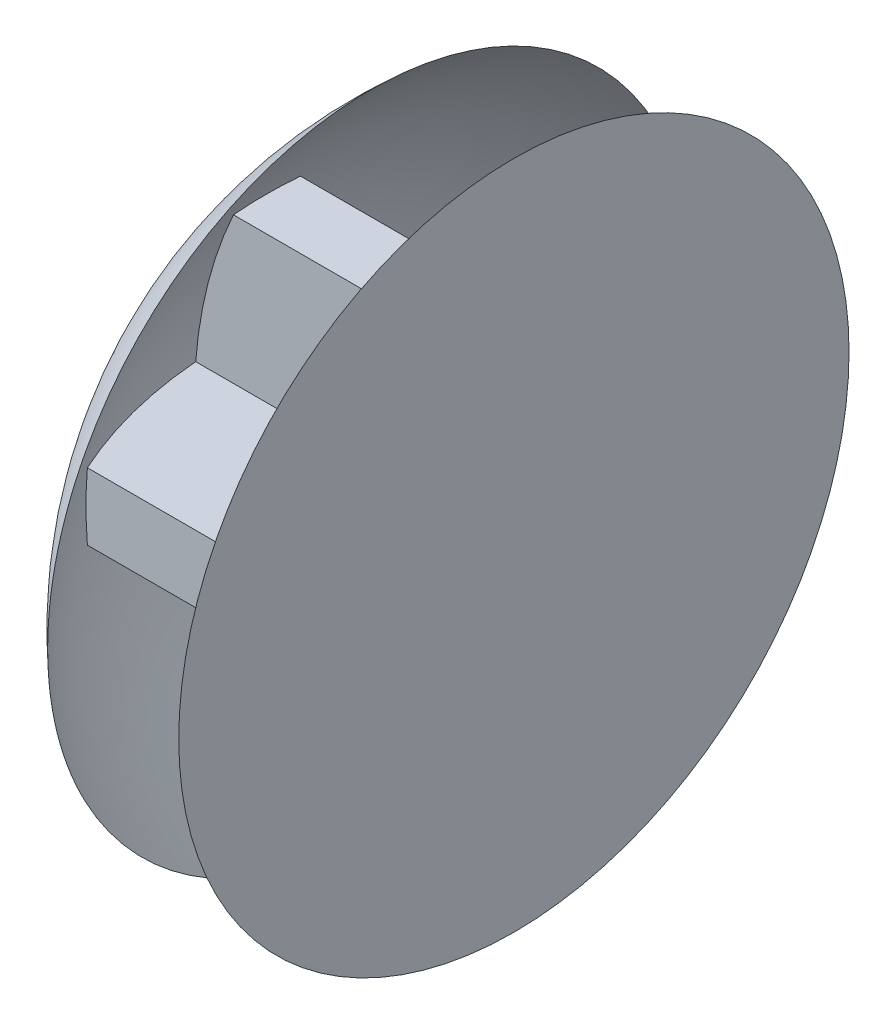
ISO-10303-21;
HEADER;
FILE_DESCRIPTION(('STEP AP214'),'2;1');
FILE_NAME('part.step','',(''),(''),'','','');
FILE_SCHEMA(('AUTOMOTIVE_DESIGN { 1 0 10303 214 1 1 1 1 }'));
ENDSEC;
DATA;
#1=APPLICATION_CONTEXT('core data for automotive mechanical design processes');
#2=APPLICATION_PROTOCOL_DEFINITION('international standard','automotive_design',2000,#1);
#3=PRODUCT_CONTEXT('',#1,'mechanical');
#4=PRODUCT('Part','Part','',(#3));
#5=PRODUCT_RELATED_PRODUCT_CATEGORY('part','',(#4));
#6=PRODUCT_DEFINITION_FORMATION('','',#4);
#7=PRODUCT_DEFINITION_CONTEXT('part definition',#1,'design');
#8=PRODUCT_DEFINITION('design','',#6,#7);
#9=PRODUCT_DEFINITION_SHAPE('','',#8);
#10=(LENGTH_UNIT() NAMED_UNIT(*) SI_UNIT(.MILLI.,.METRE.));
#11=(NAMED_UNIT(*) PLANE_ANGLE_UNIT() SI_UNIT($,.RADIAN.));
#12=(NAMED_UNIT(*) SI_UNIT($,.STERADIAN.) SOLID_ANGLE_UNIT());
#13=UNCERTAINTY_MEASURE_WITH_UNIT(LENGTH_MEASURE(1.E-05),#10,'distance_accuracy_value','');
#14=(GEOMETRIC_REPRESENTATION_CONTEXT(3) GLOBAL_UNCERTAINTY_ASSIGNED_CONTEXT((#13)) GLOBAL_UNIT_ASSIGNED_CONTEXT((#10,
#11,#12)) REPRESENTATION_CONTEXT('',''));
#15=CARTESIAN_POINT('',(0.,0.,0.));
#16=DIRECTION('',(0.,0.,1.));
#17=DIRECTION('',(1.,0.,0.));
#18=AXIS2_PLACEMENT_3D('',#15,#16,#17);
#19=CARTESIAN_POINT('',(-3.1,-9.,12.6));
#20=DIRECTION('',(1.,0.,0.));
#21=DIRECTION('',(0.,0.,1.));
#22=AXIS2_PLACEMENT_3D('',#19,#20,#21);
#23=CONICAL_SURFACE('',#22,2.74750680188444,0.0872664625997163);
#24=CARTESIAN_POINT('',(-2.5,-9.,12.6));
#25=DIRECTION('',(1.,0.,0.));
#26=DIRECTION('',(0.,0.,1.));
#27=AXIS2_PLACEMENT_3D('',#24,#25,#26);
#28=CIRCLE('',#27,2.8);
#29=CARTESIAN_POINT('',(-2.5,-9.00000000000011,9.8));
#30=VERTEX_POINT('',#29);
#31=EDGE_CURVE('E28',#30,#30,#28,.T.);
#32=ORIENTED_EDGE('',*,*,#31,.F.);
#33=DIRECTION('',(-0.996194698091746,0.,0.087155742747658));
#34=VECTOR('',#33,1.);
#35=CARTESIAN_POINT('',(-3.1,-9.00000000000011,9.85249319811556));
#36=LINE('',#35,#34);
#37=CARTESIAN_POINT('',(-3.7,-9.,9.90498639623111));
#38=VERTEX_POINT('',#37);
#39=EDGE_CURVE('E11',#30,#38,#36,.T.);
#40=ORIENTED_EDGE('',*,*,#39,.T.);
#41=CARTESIAN_POINT('',(-3.7,-9.,12.6));
#42=DIRECTION('',(1.,0.,0.));
#43=DIRECTION('',(0.,0.,1.));
#44=AXIS2_PLACEMENT_3D('',#41,#42,#43);
#45=CIRCLE('',#44,2.69501360376889);
#46=EDGE_CURVE('E208',#38,#38,#45,.T.);
#47=ORIENTED_EDGE('',*,*,#46,.T.);
#48=ORIENTED_EDGE('',*,*,#39,.F.);
#49=EDGE_LOOP('',(#32,#40,#47,#48));
#50=FACE_BOUND('',#49,.T.);
#51=ADVANCED_FACE('F17',(#50),#23,.T.);
#52=CARTESIAN_POINT('',(-2.5,-9.,14.));
#53=DIRECTION('',(1.,0.,0.));
#54=DIRECTION('',(0.,1.,0.));
#55=AXIS2_PLACEMENT_3D('',#52,#53,#54);
#56=PLANE('',#55);
#57=ORIENTED_EDGE('',*,*,#31,.T.);
#58=EDGE_LOOP('',(#57));
#59=FACE_BOUND('',#58,.T.);
#60=ADVANCED_FACE('F19',(#59),#56,.T.);
#61=CARTESIAN_POINT('',(-1.27370903145859,-9.,12.6));
#62=DIRECTION('',(0.,0.,1.));
#63=DIRECTION('',(-0.99999334279677,0.00364888505458274,0.));
#64=AXIS2_PLACEMENT_3D('',#61,#62,#63);
#65=SPHERICAL_SURFACE('',#64,3.62629096854142);
#66=CARTESIAN_POINT('',(-1.27370903145859,-9.,11.1));
#67=DIRECTION('',(0.,0.,-1.));
#68=DIRECTION('',(0.,-1.,0.));
#69=AXIS2_PLACEMENT_3D('',#66,#67,#68);
#70=CIRCLE('',#69,3.3015127121556);
#71=CARTESIAN_POINT('',(-4.5633269710566,-9.28,11.1));
#72=VERTEX_POINT('',#71);
#73=CARTESIAN_POINT('',(-4.5633269710566,-8.72,11.1));
#74=VERTEX_POINT('',#73);
#75=EDGE_CURVE('E180',#72,#74,#70,.T.);
#76=ORIENTED_EDGE('',*,*,#75,.T.);
#77=CARTESIAN_POINT('',(-1.27370903145859,-8.72,12.6));
#78=DIRECTION('',(0.,1.,0.));
#79=DIRECTION('',(0.,0.,-1.));
#80=AXIS2_PLACEMENT_3D('',#77,#78,#79);
#81=CIRCLE('',#80,3.61546486478918);
#82=CARTESIAN_POINT('',(-4.87831527743402,-8.72,12.32));
#83=VERTEX_POINT('',#82);
#84=EDGE_CURVE('E92',#74,#83,#81,.T.);
#85=ORIENTED_EDGE('',*,*,#84,.T.);
#86=CARTESIAN_POINT('',(-1.27370903145859,-9.,12.32));
#87=DIRECTION('',(0.,0.,-1.));
#88=DIRECTION('',(0.,-1.,0.));
#89=AXIS2_PLACEMENT_3D('',#86,#87,#88);
#90=CIRCLE('',#89,3.61546486478918);
#91=CARTESIAN_POINT('',(-4.5633269710566,-7.5,12.32));
#92=VERTEX_POINT('',#91);
#93=EDGE_CURVE('E103',#83,#92,#90,.T.);
#94=ORIENTED_EDGE('',*,*,#93,.T.);
#95=CARTESIAN_POINT('',(-1.27370903145859,-7.5,12.6));
#96=DIRECTION('',(0.,1.,0.));
#97=DIRECTION('',(0.,0.,-1.));
#98=AXIS2_PLACEMENT_3D('',#95,#96,#97);
#99=CIRCLE('',#98,3.3015127121556);
#100=CARTESIAN_POINT('',(-4.5633269710566,-7.5,12.88));
#101=VERTEX_POINT('',#100);
#102=EDGE_CURVE('E205',#92,#101,#99,.T.);
#103=ORIENTED_EDGE('',*,*,#102,.T.);
#104=CARTESIAN_POINT('',(-1.27370903145859,-9.,12.88));
#105=DIRECTION('',(0.,0.,1.));
#106=DIRECTION('',(0.,1.,0.));
#107=AXIS2_PLACEMENT_3D('',#104,#105,#106);
#108=CIRCLE('',#107,3.61546486478918);
#109=CARTESIAN_POINT('',(-4.87831527743401,-8.72,12.88));
#110=VERTEX_POINT('',#109);
#111=EDGE_CURVE('E229',#101,#110,#108,.T.);
#112=ORIENTED_EDGE('',*,*,#111,.T.);
#113=CARTESIAN_POINT('',(-1.27370903145859,-8.72,12.6));
#114=DIRECTION('',(0.,1.,0.));
#115=DIRECTION('',(0.,0.,-1.));
#116=AXIS2_PLACEMENT_3D('',#113,#114,#115);
#117=CIRCLE('',#116,3.61546486478918);
#118=CARTESIAN_POINT('',(-4.56332697105659,-8.72,14.1));
#119=VERTEX_POINT('',#118);
#120=EDGE_CURVE('E243',#110,#119,#117,.T.);
#121=ORIENTED_EDGE('',*,*,#120,.T.);
#122=CARTESIAN_POINT('',(-1.27370903145859,-9.,14.1));
#123=DIRECTION('',(0.,0.,1.));
#124=DIRECTION('',(0.,1.,0.));
#125=AXIS2_PLACEMENT_3D('',#122,#123,#124);
#126=CIRCLE('',#125,3.3015127121556);
#127=CARTESIAN_POINT('',(-4.56332697105659,-9.28,14.1));
#128=VERTEX_POINT('',#127);
#129=EDGE_CURVE('E210',#119,#128,#126,.T.);
#130=ORIENTED_EDGE('',*,*,#129,.T.);
#131=CARTESIAN_POINT('',(-1.27370903145859,-9.28,12.6));
#132=DIRECTION('',(0.,-1.,0.));
#133=DIRECTION('',(0.,0.,1.));
#134=AXIS2_PLACEMENT_3D('',#131,#132,#133);
#135=CIRCLE('',#134,3.61546486478918);
#136=CARTESIAN_POINT('',(-4.87831527743401,-9.28,12.88));
#137=VERTEX_POINT('',#136);
#138=EDGE_CURVE('E225',#128,#137,#135,.T.);
#139=ORIENTED_EDGE('',*,*,#138,.T.);
#140=CARTESIAN_POINT('',(-1.27370903145859,-9.,12.88));
#141=DIRECTION('',(0.,0.,1.));
#142=DIRECTION('',(0.,1.,0.));
#143=AXIS2_PLACEMENT_3D('',#140,#141,#142);
#144=CIRCLE('',#143,3.61546486478918);
#145=CARTESIAN_POINT('',(-4.5633269710566,-10.5,12.88));
#146=VERTEX_POINT('',#145);
#147=EDGE_CURVE('E291',#137,#146,#144,.T.);
#148=ORIENTED_EDGE('',*,*,#147,.T.);
#149=CARTESIAN_POINT('',(-1.27370903145859,-10.5,12.6));
#150=DIRECTION('',(0.,-1.,0.));
#151=DIRECTION('',(0.,0.,1.));
#152=AXIS2_PLACEMENT_3D('',#149,#150,#151);
#153=CIRCLE('',#152,3.3015127121556);
#154=CARTESIAN_POINT('',(-4.5633269710566,-10.5,12.32));
#155=VERTEX_POINT('',#154);
#156=EDGE_CURVE('E218',#146,#155,#153,.T.);
#157=ORIENTED_EDGE('',*,*,#156,.T.);
#158=CARTESIAN_POINT('',(-1.27370903145859,-9.,12.32));
#159=DIRECTION('',(0.,0.,-1.));
#160=DIRECTION('',(0.,-1.,0.));
#161=AXIS2_PLACEMENT_3D('',#158,#159,#160);
#162=CIRCLE('',#161,3.61546486478918);
#163=CARTESIAN_POINT('',(-4.87831527743402,-9.28,12.32));
#164=VERTEX_POINT('',#163);
#165=EDGE_CURVE('E260',#155,#164,#162,.T.);
#166=ORIENTED_EDGE('',*,*,#165,.T.);
#167=CARTESIAN_POINT('',(-1.27370903145859,-9.28,12.6));
#168=DIRECTION('',(0.,-1.,0.));
#169=DIRECTION('',(0.,0.,1.));
#170=AXIS2_PLACEMENT_3D('',#167,#168,#169);
#171=CIRCLE('',#170,3.61546486478918);
#172=EDGE_CURVE('E263',#164,#72,#171,.T.);
#173=ORIENTED_EDGE('',*,*,#172,.T.);
#174=EDGE_LOOP('',(#76,#85,#94,#103,#112,#121,#130,#139,#148,#157,#166,#173));
#175=FACE_BOUND('',#174,.T.);
#176=ORIENTED_EDGE('',*,*,#46,.F.);
#177=EDGE_LOOP('',(#176));
#178=FACE_BOUND('',#177,.T.);
#179=ADVANCED_FACE('F335',(#175,#178),#65,.T.);
#180=CARTESIAN_POINT('',(-4.,-9.,14.1));
#181=DIRECTION('',(0.,0.,1.));
#182=DIRECTION('',(1.,0.,0.));
#183=AXIS2_PLACEMENT_3D('',#180,#181,#182);
#184=PLANE('',#183);
#185=ORIENTED_EDGE('',*,*,#129,.F.);
#186=DIRECTION('',(-1.,0.,0.));
#187=VECTOR('',#186,1.);
#188=CARTESIAN_POINT('',(-4.,-8.72,14.1));
#189=LINE('',#188,#187);
#190=CARTESIAN_POINT('',(-3.1,-8.72,14.1));
#191=VERTEX_POINT('',#190);
#192=EDGE_CURVE('E244',#191,#119,#189,.T.);
#193=ORIENTED_EDGE('',*,*,#192,.F.);
#194=DIRECTION('',(0.,1.,0.));
#195=VECTOR('',#194,1.);
#196=CARTESIAN_POINT('',(-3.1,-9.,14.1));
#197=LINE('',#196,#195);
#198=CARTESIAN_POINT('',(-3.1,-9.28,14.1));
#199=VERTEX_POINT('',#198);
#200=EDGE_CURVE('E271',#199,#191,#197,.T.);
#201=ORIENTED_EDGE('',*,*,#200,.F.);
#202=DIRECTION('',(1.,0.,0.));
#203=VECTOR('',#202,1.);
#204=CARTESIAN_POINT('',(-4.,-9.28,14.1));
#205=LINE('',#204,#203);
#206=EDGE_CURVE('E223',#128,#199,#205,.T.);
#207=ORIENTED_EDGE('',*,*,#206,.F.);
#208=EDGE_LOOP('',(#185,#193,#201,#207));
#209=FACE_BOUND('',#208,.T.);
#210=ADVANCED_FACE('F300',(#209),#184,.F.);
#211=CARTESIAN_POINT('',(-4.,-9.28,12.6));
#212=DIRECTION('',(0.,1.,0.));
#213=DIRECTION('',(1.,0.,0.));
#214=AXIS2_PLACEMENT_3D('',#211,#212,#213);
#215=PLANE('',#214);
#216=DIRECTION('',(-1.,0.,0.));
#217=VECTOR('',#216,1.);
#218=CARTESIAN_POINT('',(-4.,-9.28,12.88));
#219=LINE('',#218,#217);
#220=CARTESIAN_POINT('',(-3.1,-9.28,12.88));
#221=VERTEX_POINT('',#220);
#222=EDGE_CURVE('E266',#221,#137,#219,.T.);
#223=ORIENTED_EDGE('',*,*,#222,.T.);
#224=ORIENTED_EDGE('',*,*,#138,.F.);
#225=ORIENTED_EDGE('',*,*,#206,.T.);
#226=DIRECTION('',(0.,0.,-1.));
#227=VECTOR('',#226,1.);
#228=CARTESIAN_POINT('',(-3.1,-9.28,12.6));
#229=LINE('',#228,#227);
#230=EDGE_CURVE('E267',#199,#221,#229,.T.);
#231=ORIENTED_EDGE('',*,*,#230,.T.);
#232=EDGE_LOOP('',(#223,#224,#225,#231));
#233=FACE_BOUND('',#232,.T.);
#234=ADVANCED_FACE('F296',(#233),#215,.T.);
#235=CARTESIAN_POINT('',(-4.,-9.,12.88));
#236=DIRECTION('',(0.,0.,-1.));
#237=DIRECTION('',(0.,-1.,0.));
#238=AXIS2_PLACEMENT_3D('',#235,#236,#237);
#239=PLANE('',#238);
#240=ORIENTED_EDGE('',*,*,#147,.F.);
#241=ORIENTED_EDGE('',*,*,#222,.F.);
#242=DIRECTION('',(0.,1.,0.));
#243=VECTOR('',#242,1.);
#244=CARTESIAN_POINT('',(-3.1,-9.,12.88));
#245=LINE('',#244,#243);
#246=CARTESIAN_POINT('',(-3.1,-10.5,12.88));
#247=VERTEX_POINT('',#246);
#248=EDGE_CURVE('E254',#247,#221,#245,.T.);
#249=ORIENTED_EDGE('',*,*,#248,.F.);
#250=DIRECTION('',(-1.,0.,0.));
#251=VECTOR('',#250,1.);
#252=CARTESIAN_POINT('',(-4.,-10.5,12.88));
#253=LINE('',#252,#251);
#254=EDGE_CURVE('E222',#247,#146,#253,.T.);
#255=ORIENTED_EDGE('',*,*,#254,.T.);
#256=EDGE_LOOP('',(#240,#241,#249,#255));
#257=FACE_BOUND('',#256,.T.);
#258=ADVANCED_FACE('F288',(#257),#239,.T.);
#259=CARTESIAN_POINT('',(-4.,-10.5,12.6));
#260=DIRECTION('',(0.,-1.,0.));
#261=DIRECTION('',(0.,0.,-1.));
#262=AXIS2_PLACEMENT_3D('',#259,#260,#261);
#263=PLANE('',#262);
#264=ORIENTED_EDGE('',*,*,#156,.F.);
#265=ORIENTED_EDGE('',*,*,#254,.F.);
#266=DIRECTION('',(0.,0.,1.));
#267=VECTOR('',#266,1.);
#268=CARTESIAN_POINT('',(-3.1,-10.5,12.6));
#269=LINE('',#268,#267);
#270=CARTESIAN_POINT('',(-3.1,-10.5,12.32));
#271=VERTEX_POINT('',#270);
#272=EDGE_CURVE('E250',#271,#247,#269,.T.);
#273=ORIENTED_EDGE('',*,*,#272,.F.);
#274=DIRECTION('',(1.,0.,0.));
#275=VECTOR('',#274,1.);
#276=CARTESIAN_POINT('',(-4.,-10.5,12.32));
#277=LINE('',#276,#275);
#278=EDGE_CURVE('E159',#155,#271,#277,.T.);
#279=ORIENTED_EDGE('',*,*,#278,.F.);
#280=EDGE_LOOP('',(#264,#265,#273,#279));
#281=FACE_BOUND('',#280,.T.);
#282=ADVANCED_FACE('F361',(#281),#263,.F.);
#283=CARTESIAN_POINT('',(-4.,-9.,12.32));
#284=DIRECTION('',(0.,0.,1.));
#285=DIRECTION('',(1.,0.,0.));
#286=AXIS2_PLACEMENT_3D('',#283,#284,#285);
#287=PLANE('',#286);
#288=ORIENTED_EDGE('',*,*,#165,.F.);
#289=ORIENTED_EDGE('',*,*,#278,.T.);
#290=DIRECTION('',(0.,1.,0.));
#291=VECTOR('',#290,1.);
#292=CARTESIAN_POINT('',(-3.1,-9.,12.32));
#293=LINE('',#292,#291);
#294=CARTESIAN_POINT('',(-3.1,-9.28,12.32));
#295=VERTEX_POINT('',#294);
#296=EDGE_CURVE('E189',#271,#295,#293,.T.);
#297=ORIENTED_EDGE('',*,*,#296,.T.);
#298=DIRECTION('',(1.,0.,0.));
#299=VECTOR('',#298,1.);
#300=CARTESIAN_POINT('',(-4.,-9.28,12.32));
#301=LINE('',#300,#299);
#302=EDGE_CURVE('E21',#164,#295,#301,.T.);
#303=ORIENTED_EDGE('',*,*,#302,.F.);
#304=EDGE_LOOP('',(#288,#289,#297,#303));
#305=FACE_BOUND('',#304,.T.);
#306=ADVANCED_FACE('F366',(#305),#287,.T.);
#307=CARTESIAN_POINT('',(-4.,-9.28,12.6));
#308=DIRECTION('',(0.,1.,0.));
#309=DIRECTION('',(1.,0.,0.));
#310=AXIS2_PLACEMENT_3D('',#307,#308,#309);
#311=PLANE('',#310);
#312=ORIENTED_EDGE('',*,*,#302,.T.);
#313=DIRECTION('',(0.,0.,-1.));
#314=VECTOR('',#313,1.);
#315=CARTESIAN_POINT('',(-3.1,-9.28,12.6));
#316=LINE('',#315,#314);
#317=CARTESIAN_POINT('',(-3.1,-9.28,11.1));
#318=VERTEX_POINT('',#317);
#319=EDGE_CURVE('E184',#295,#318,#316,.T.);
#320=ORIENTED_EDGE('',*,*,#319,.T.);
#321=DIRECTION('',(-1.,0.,0.));
#322=VECTOR('',#321,1.);
#323=CARTESIAN_POINT('',(-4.,-9.28,11.1));
#324=LINE('',#323,#322);
#325=EDGE_CURVE('E174',#318,#72,#324,.T.);
#326=ORIENTED_EDGE('',*,*,#325,.T.);
#327=ORIENTED_EDGE('',*,*,#172,.F.);
#328=EDGE_LOOP('',(#312,#320,#326,#327));
#329=FACE_BOUND('',#328,.T.);
#330=ADVANCED_FACE('F185',(#329),#311,.T.);
#331=CARTESIAN_POINT('',(-4.,-9.,11.1));
#332=DIRECTION('',(0.,0.,1.));
#333=DIRECTION('',(1.,0.,0.));
#334=AXIS2_PLACEMENT_3D('',#331,#332,#333);
#335=PLANE('',#334);
#336=ORIENTED_EDGE('',*,*,#75,.F.);
#337=ORIENTED_EDGE('',*,*,#325,.F.);
#338=DIRECTION('',(0.,-1.,0.));
#339=VECTOR('',#338,1.);
#340=CARTESIAN_POINT('',(-3.1,-9.,11.1));
#341=LINE('',#340,#339);
#342=CARTESIAN_POINT('',(-3.1,-8.72,11.1));
#343=VERTEX_POINT('',#342);
#344=EDGE_CURVE('E178',#343,#318,#341,.T.);
#345=ORIENTED_EDGE('',*,*,#344,.F.);
#346=DIRECTION('',(1.,0.,0.));
#347=VECTOR('',#346,1.);
#348=CARTESIAN_POINT('',(-4.,-8.72,11.1));
#349=LINE('',#348,#347);
#350=EDGE_CURVE('E212',#74,#343,#349,.T.);
#351=ORIENTED_EDGE('',*,*,#350,.F.);
#352=EDGE_LOOP('',(#336,#337,#345,#351));
#353=FACE_BOUND('',#352,.T.);
#354=ADVANCED_FACE('F175',(#353),#335,.T.);
#355=CARTESIAN_POINT('',(-4.,-8.72,12.6));
#356=DIRECTION('',(0.,-1.,0.));
#357=DIRECTION('',(0.,0.,-1.));
#358=AXIS2_PLACEMENT_3D('',#355,#356,#357);
#359=PLANE('',#358);
#360=DIRECTION('',(-1.,0.,0.));
#361=VECTOR('',#360,1.);
#362=CARTESIAN_POINT('',(-4.,-8.72,12.32));
#363=LINE('',#362,#361);
#364=CARTESIAN_POINT('',(-3.1,-8.72,12.32));
#365=VERTEX_POINT('',#364);
#366=EDGE_CURVE('E217',#365,#83,#363,.T.);
#367=ORIENTED_EDGE('',*,*,#366,.T.);
#368=ORIENTED_EDGE('',*,*,#84,.F.);
#369=ORIENTED_EDGE('',*,*,#350,.T.);
#370=DIRECTION('',(0.,0.,-1.));
#371=VECTOR('',#370,1.);
#372=CARTESIAN_POINT('',(-3.1,-8.72,12.6));
#373=LINE('',#372,#371);
#374=EDGE_CURVE('E194',#365,#343,#373,.T.);
#375=ORIENTED_EDGE('',*,*,#374,.F.);
#376=EDGE_LOOP('',(#367,#368,#369,#375));
#377=FACE_BOUND('',#376,.T.);
#378=ADVANCED_FACE('F328',(#377),#359,.T.);
#379=CARTESIAN_POINT('',(-4.,-9.,12.32));
#380=DIRECTION('',(0.,0.,1.));
#381=DIRECTION('',(1.,0.,0.));
#382=AXIS2_PLACEMENT_3D('',#379,#380,#381);
#383=PLANE('',#382);
#384=ORIENTED_EDGE('',*,*,#93,.F.);
#385=ORIENTED_EDGE('',*,*,#366,.F.);
#386=DIRECTION('',(0.,1.,0.));
#387=VECTOR('',#386,1.);
#388=CARTESIAN_POINT('',(-3.1,-9.,12.32));
#389=LINE('',#388,#387);
#390=CARTESIAN_POINT('',(-3.1,-7.5,12.32));
#391=VERTEX_POINT('',#390);
#392=EDGE_CURVE('E235',#365,#391,#389,.T.);
#393=ORIENTED_EDGE('',*,*,#392,.T.);
#394=DIRECTION('',(-1.,0.,0.));
#395=VECTOR('',#394,1.);
#396=CARTESIAN_POINT('',(-4.,-7.5,12.32));
#397=LINE('',#396,#395);
#398=EDGE_CURVE('E207',#391,#92,#397,.T.);
#399=ORIENTED_EDGE('',*,*,#398,.T.);
#400=EDGE_LOOP('',(#384,#385,#393,#399));
#401=FACE_BOUND('',#400,.T.);
#402=ADVANCED_FACE('F330',(#401),#383,.T.);
#403=CARTESIAN_POINT('',(-4.,-7.5,12.6));
#404=DIRECTION('',(0.,-1.,0.));
#405=DIRECTION('',(0.,0.,-1.));
#406=AXIS2_PLACEMENT_3D('',#403,#404,#405);
#407=PLANE('',#406);
#408=ORIENTED_EDGE('',*,*,#102,.F.);
#409=ORIENTED_EDGE('',*,*,#398,.F.);
#410=DIRECTION('',(0.,0.,-1.));
#411=VECTOR('',#410,1.);
#412=CARTESIAN_POINT('',(-3.1,-7.5,12.6));
#413=LINE('',#412,#411);
#414=CARTESIAN_POINT('',(-3.1,-7.5,12.88));
#415=VERTEX_POINT('',#414);
#416=EDGE_CURVE('E204',#415,#391,#413,.T.);
#417=ORIENTED_EDGE('',*,*,#416,.F.);
#418=DIRECTION('',(1.,0.,0.));
#419=VECTOR('',#418,1.);
#420=CARTESIAN_POINT('',(-4.,-7.5,12.88));
#421=LINE('',#420,#419);
#422=EDGE_CURVE('E137',#101,#415,#421,.T.);
#423=ORIENTED_EDGE('',*,*,#422,.F.);
#424=EDGE_LOOP('',(#408,#409,#417,#423));
#425=FACE_BOUND('',#424,.T.);
#426=ADVANCED_FACE('F334',(#425),#407,.T.);
#427=CARTESIAN_POINT('',(-4.,-9.,12.88));
#428=DIRECTION('',(0.,0.,-1.));
#429=DIRECTION('',(0.,-1.,0.));
#430=AXIS2_PLACEMENT_3D('',#427,#428,#429);
#431=PLANE('',#430);
#432=ORIENTED_EDGE('',*,*,#111,.F.);
#433=ORIENTED_EDGE('',*,*,#422,.T.);
#434=DIRECTION('',(0.,1.,0.));
#435=VECTOR('',#434,1.);
#436=CARTESIAN_POINT('',(-3.1,-9.,12.88));
#437=LINE('',#436,#435);
#438=CARTESIAN_POINT('',(-3.1,-8.72,12.88));
#439=VERTEX_POINT('',#438);
#440=EDGE_CURVE('E230',#439,#415,#437,.T.);
#441=ORIENTED_EDGE('',*,*,#440,.F.);
#442=DIRECTION('',(1.,0.,0.));
#443=VECTOR('',#442,1.);
#444=CARTESIAN_POINT('',(-4.,-8.72,12.88));
#445=LINE('',#444,#443);
#446=EDGE_CURVE('E150',#110,#439,#445,.T.);
#447=ORIENTED_EDGE('',*,*,#446,.F.);
#448=EDGE_LOOP('',(#432,#433,#441,#447));
#449=FACE_BOUND('',#448,.T.);
#450=ADVANCED_FACE('F338',(#449),#431,.T.);
#451=CARTESIAN_POINT('',(-4.,-8.72,12.6));
#452=DIRECTION('',(0.,-1.,0.));
#453=DIRECTION('',(0.,0.,-1.));
#454=AXIS2_PLACEMENT_3D('',#451,#452,#453);
#455=PLANE('',#454);
#456=ORIENTED_EDGE('',*,*,#446,.T.);
#457=DIRECTION('',(0.,0.,-1.));
#458=VECTOR('',#457,1.);
#459=CARTESIAN_POINT('',(-3.1,-8.72,12.6));
#460=LINE('',#459,#458);
#461=EDGE_CURVE('E233',#191,#439,#460,.T.);
#462=ORIENTED_EDGE('',*,*,#461,.F.);
#463=ORIENTED_EDGE('',*,*,#192,.T.);
#464=ORIENTED_EDGE('',*,*,#120,.F.);
#465=EDGE_LOOP('',(#456,#462,#463,#464));
#466=FACE_BOUND('',#465,.T.);
#467=ADVANCED_FACE('F337',(#466),#455,.T.);
#468=CARTESIAN_POINT('',(-3.1,-9.,12.6));
#469=DIRECTION('',(-1.,0.,0.));
#470=DIRECTION('',(0.,0.,1.));
#471=AXIS2_PLACEMENT_3D('',#468,#469,#470);
#472=PLANE('',#471);
#473=ORIENTED_EDGE('',*,*,#374,.T.);
#474=ORIENTED_EDGE('',*,*,#344,.T.);
#475=ORIENTED_EDGE('',*,*,#319,.F.);
#476=ORIENTED_EDGE('',*,*,#296,.F.);
#477=ORIENTED_EDGE('',*,*,#272,.T.);
#478=ORIENTED_EDGE('',*,*,#248,.T.);
#479=ORIENTED_EDGE('',*,*,#230,.F.);
#480=ORIENTED_EDGE('',*,*,#200,.T.);
#481=ORIENTED_EDGE('',*,*,#461,.T.);
#482=ORIENTED_EDGE('',*,*,#440,.T.);
#483=ORIENTED_EDGE('',*,*,#416,.T.);
#484=ORIENTED_EDGE('',*,*,#392,.F.);
#485=EDGE_LOOP('',(#473,#474,#475,#476,#477,#478,#479,#480,#481,#482,#483,#484));
#486=FACE_BOUND('',#485,.T.);
#487=ADVANCED_FACE('F191',(#486),#472,.T.);
#488=CLOSED_SHELL('',(#51,#60,#179,#210,#234,#258,#282,#306,#330,#354,#378,#402,#426,#450,#467,#487));
#489=MANIFOLD_SOLID_BREP('B1',#488);
#490=ADVANCED_BREP_SHAPE_REPRESENTATION('',(#18,#489),#14);
#491=SHAPE_DEFINITION_REPRESENTATION(#9,#490);
ENDSEC;
END-ISO-10303-21;
